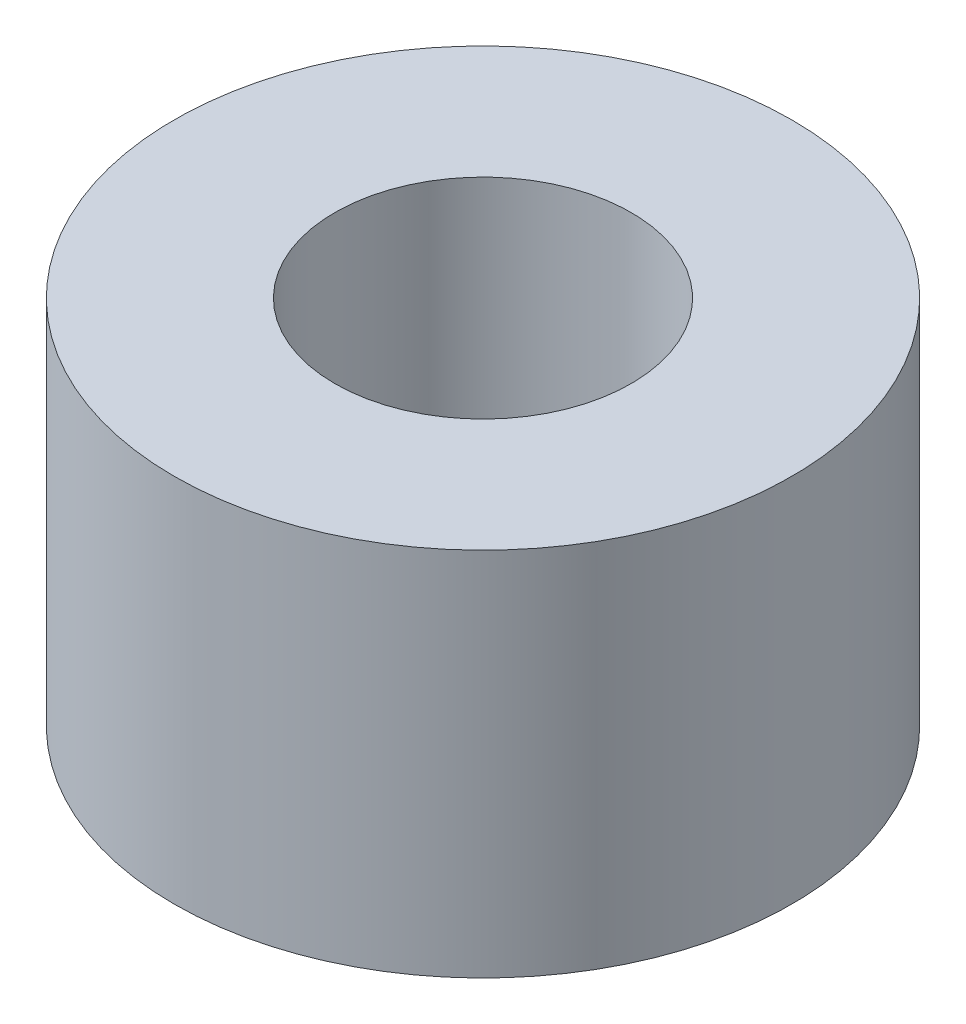
ISO-10303-21;
HEADER;
FILE_DESCRIPTION(('STEP AP214'),'2;1');
FILE_NAME('part.step','',(''),(''),'','','');
FILE_SCHEMA(('AUTOMOTIVE_DESIGN { 1 0 10303 214 1 1 1 1 }'));
ENDSEC;
DATA;
#1=APPLICATION_CONTEXT('core data for automotive mechanical design processes');
#2=APPLICATION_PROTOCOL_DEFINITION('international standard','automotive_design',2000,#1);
#3=PRODUCT_CONTEXT('',#1,'mechanical');
#4=PRODUCT('Part','Part','',(#3));
#5=PRODUCT_RELATED_PRODUCT_CATEGORY('part','',(#4));
#6=PRODUCT_DEFINITION_FORMATION('','',#4);
#7=PRODUCT_DEFINITION_CONTEXT('part definition',#1,'design');
#8=PRODUCT_DEFINITION('design','',#6,#7);
#9=PRODUCT_DEFINITION_SHAPE('','',#8);
#10=(LENGTH_UNIT() NAMED_UNIT(*) SI_UNIT(.MILLI.,.METRE.));
#11=(NAMED_UNIT(*) PLANE_ANGLE_UNIT() SI_UNIT($,.RADIAN.));
#12=(NAMED_UNIT(*) SI_UNIT($,.STERADIAN.) SOLID_ANGLE_UNIT());
#13=UNCERTAINTY_MEASURE_WITH_UNIT(LENGTH_MEASURE(1.E-05),#10,'distance_accuracy_value','');
#14=(GEOMETRIC_REPRESENTATION_CONTEXT(3) GLOBAL_UNCERTAINTY_ASSIGNED_CONTEXT((#13)) GLOBAL_UNIT_ASSIGNED_CONTEXT((#10,
#11,#12)) REPRESENTATION_CONTEXT('',''));
#15=CARTESIAN_POINT('',(0.,0.,0.));
#16=DIRECTION('',(0.,0.,1.));
#17=DIRECTION('',(1.,0.,0.));
#18=AXIS2_PLACEMENT_3D('',#15,#16,#17);
#19=CARTESIAN_POINT('',(0.,25.1724137931034,125.));
#20=DIRECTION('',(0.,1.,0.));
#21=DIRECTION('',(0.,0.,1.));
#22=AXIS2_PLACEMENT_3D('',#19,#20,#21);
#23=PLANE('',#22);
#24=CARTESIAN_POINT('',(0.,25.1724137931034,0.));
#25=DIRECTION('',(0.,1.,0.));
#26=DIRECTION('',(0.,0.,1.));
#27=AXIS2_PLACEMENT_3D('',#24,#25,#26);
#28=CIRCLE('',#27,125.);
#29=CARTESIAN_POINT('',(0.,25.1724137931034,125.));
#30=VERTEX_POINT('',#29);
#31=EDGE_CURVE('E45',#30,#30,#28,.T.);
#32=ORIENTED_EDGE('',*,*,#31,.T.);
#33=EDGE_LOOP('',(#32));
#34=FACE_BOUND('',#33,.T.);
#35=CARTESIAN_POINT('',(0.,25.1724137931034,0.));
#36=DIRECTION('',(0.,1.,0.));
#37=DIRECTION('',(0.,0.,1.));
#38=AXIS2_PLACEMENT_3D('',#35,#36,#37);
#39=CIRCLE('',#38,60.);
#40=CARTESIAN_POINT('',(0.,25.1724137931034,60.));
#41=VERTEX_POINT('',#40);
#42=EDGE_CURVE('E10',#41,#41,#39,.T.);
#43=ORIENTED_EDGE('',*,*,#42,.F.);
#44=EDGE_LOOP('',(#43));
#45=FACE_BOUND('',#44,.T.);
#46=ADVANCED_FACE('F31',(#34,#45),#23,.T.);
#47=CARTESIAN_POINT('',(0.,120.,0.));
#48=DIRECTION('',(0.,1.,0.));
#49=DIRECTION('',(0.,0.,1.));
#50=AXIS2_PLACEMENT_3D('',#47,#48,#49);
#51=CYLINDRICAL_SURFACE('',#50,60.);
#52=ORIENTED_EDGE('',*,*,#42,.T.);
#53=EDGE_LOOP('',(#52));
#54=FACE_BOUND('',#53,.T.);
#55=CARTESIAN_POINT('',(0.,-109.827586206897,0.));
#56=DIRECTION('',(0.,1.,0.));
#57=DIRECTION('',(0.,0.,1.));
#58=AXIS2_PLACEMENT_3D('',#55,#56,#57);
#59=CIRCLE('',#58,60.);
#60=CARTESIAN_POINT('',(0.,-109.827586206897,60.));
#61=VERTEX_POINT('',#60);
#62=EDGE_CURVE('E37',#61,#61,#59,.T.);
#63=ORIENTED_EDGE('',*,*,#62,.F.);
#64=EDGE_LOOP('',(#63));
#65=FACE_BOUND('',#64,.T.);
#66=ADVANCED_FACE('F65',(#54,#65),#51,.F.);
#67=CARTESIAN_POINT('',(0.,-109.827586206897,60.));
#68=DIRECTION('',(0.,1.,0.));
#69=DIRECTION('',(0.,0.,1.));
#70=AXIS2_PLACEMENT_3D('',#67,#68,#69);
#71=PLANE('',#70);
#72=ORIENTED_EDGE('',*,*,#62,.T.);
#73=EDGE_LOOP('',(#72));
#74=FACE_BOUND('',#73,.T.);
#75=ADVANCED_FACE('F61',(#74),#71,.T.);
#76=CARTESIAN_POINT('',(0.,-124.827586206897,125.));
#77=DIRECTION('',(0.,-1.,0.));
#78=DIRECTION('',(0.,0.,-1.));
#79=AXIS2_PLACEMENT_3D('',#76,#77,#78);
#80=PLANE('',#79);
#81=CARTESIAN_POINT('',(0.,-124.827586206897,0.));
#82=DIRECTION('',(0.,1.,0.));
#83=DIRECTION('',(0.,0.,1.));
#84=AXIS2_PLACEMENT_3D('',#81,#82,#83);
#85=CIRCLE('',#84,125.);
#86=CARTESIAN_POINT('',(0.,-124.827586206897,125.));
#87=VERTEX_POINT('',#86);
#88=EDGE_CURVE('E41',#87,#87,#85,.T.);
#89=ORIENTED_EDGE('',*,*,#88,.F.);
#90=EDGE_LOOP('',(#89));
#91=FACE_BOUND('',#90,.T.);
#92=ADVANCED_FACE('F55',(#91),#80,.T.);
#93=CARTESIAN_POINT('',(0.,120.,0.));
#94=DIRECTION('',(0.,1.,0.));
#95=DIRECTION('',(0.,0.,1.));
#96=AXIS2_PLACEMENT_3D('',#93,#94,#95);
#97=CYLINDRICAL_SURFACE('',#96,125.);
#98=ORIENTED_EDGE('',*,*,#88,.T.);
#99=EDGE_LOOP('',(#98));
#100=FACE_BOUND('',#99,.T.);
#101=ORIENTED_EDGE('',*,*,#31,.F.);
#102=EDGE_LOOP('',(#101));
#103=FACE_BOUND('',#102,.T.);
#104=ADVANCED_FACE('F53',(#100,#103),#97,.T.);
#105=CLOSED_SHELL('',(#46,#66,#75,#92,#104));
#106=MANIFOLD_SOLID_BREP('B2',#105);
#107=ADVANCED_BREP_SHAPE_REPRESENTATION('',(#18,#106),#14);
#108=SHAPE_DEFINITION_REPRESENTATION(#9,#107);
ENDSEC;
END-ISO-10303-21;
